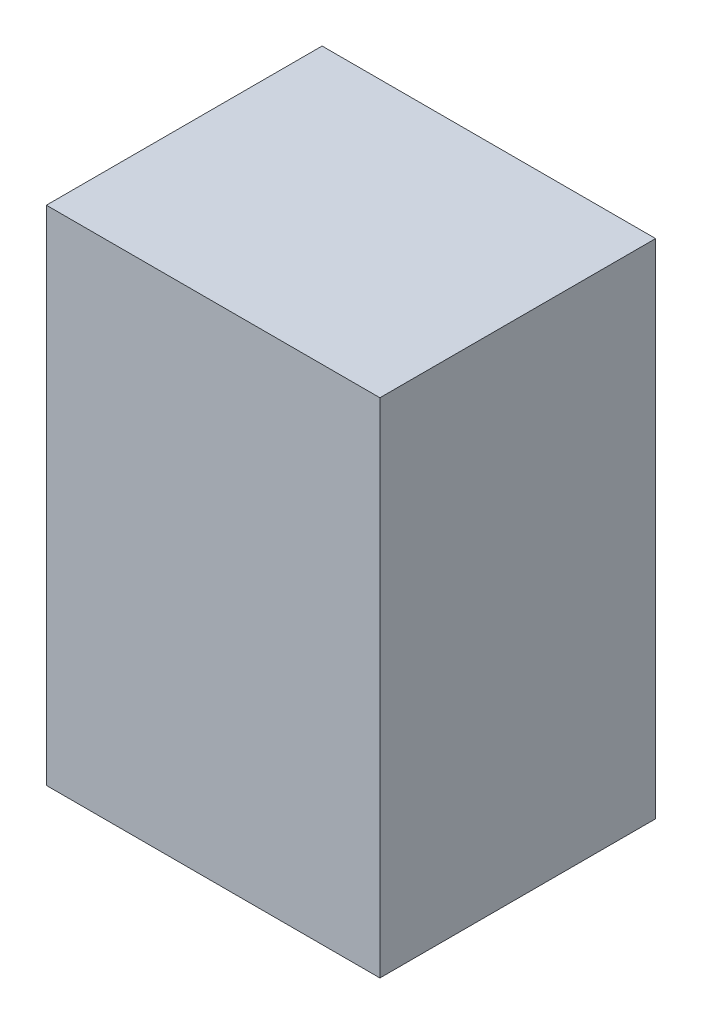
ISO-10303-21;
HEADER;
FILE_DESCRIPTION(('STEP AP214'),'2;1');
FILE_NAME('part.step','',(''),(''),'','','');
FILE_SCHEMA(('AUTOMOTIVE_DESIGN { 1 0 10303 214 1 1 1 1 }'));
ENDSEC;
DATA;
#1=APPLICATION_CONTEXT('core data for automotive mechanical design processes');
#2=APPLICATION_PROTOCOL_DEFINITION('international standard','automotive_design',2000,#1);
#3=PRODUCT_CONTEXT('',#1,'mechanical');
#4=PRODUCT('Part','Part','',(#3));
#5=PRODUCT_RELATED_PRODUCT_CATEGORY('part','',(#4));
#6=PRODUCT_DEFINITION_FORMATION('','',#4);
#7=PRODUCT_DEFINITION_CONTEXT('part definition',#1,'design');
#8=PRODUCT_DEFINITION('design','',#6,#7);
#9=PRODUCT_DEFINITION_SHAPE('','',#8);
#10=(LENGTH_UNIT() NAMED_UNIT(*) SI_UNIT(.MILLI.,.METRE.));
#11=(NAMED_UNIT(*) PLANE_ANGLE_UNIT() SI_UNIT($,.RADIAN.));
#12=(NAMED_UNIT(*) SI_UNIT($,.STERADIAN.) SOLID_ANGLE_UNIT());
#13=UNCERTAINTY_MEASURE_WITH_UNIT(LENGTH_MEASURE(1.E-05),#10,'distance_accuracy_value','');
#14=(GEOMETRIC_REPRESENTATION_CONTEXT(3) GLOBAL_UNCERTAINTY_ASSIGNED_CONTEXT((#13)) GLOBAL_UNIT_ASSIGNED_CONTEXT((#10,
#11,#12)) REPRESENTATION_CONTEXT('',''));
#15=CARTESIAN_POINT('',(0.,0.,0.));
#16=DIRECTION('',(0.,0.,1.));
#17=DIRECTION('',(1.,0.,0.));
#18=AXIS2_PLACEMENT_3D('',#15,#16,#17);
#19=CARTESIAN_POINT('',(-37.5,56.5,62.));
#20=DIRECTION('',(0.,-1.,0.));
#21=DIRECTION('',(1.,0.,0.));
#22=AXIS2_PLACEMENT_3D('',#19,#20,#21);
#23=PLANE('',#22);
#24=DIRECTION('',(-1.,0.,0.));
#25=VECTOR('',#24,1.);
#26=CARTESIAN_POINT('',(-37.5,56.5,0.));
#27=LINE('',#26,#25);
#28=CARTESIAN_POINT('',(37.5,56.5,0.));
#29=VERTEX_POINT('',#28);
#30=CARTESIAN_POINT('',(-37.5,56.5,0.));
#31=VERTEX_POINT('',#30);
#32=EDGE_CURVE('E102',#29,#31,#27,.T.);
#33=ORIENTED_EDGE('',*,*,#32,.T.);
#34=DIRECTION('',(0.,0.,-1.));
#35=VECTOR('',#34,1.);
#36=CARTESIAN_POINT('',(-37.5,56.5,62.));
#37=LINE('',#36,#35);
#38=CARTESIAN_POINT('',(-37.5,56.5,62.));
#39=VERTEX_POINT('',#38);
#40=EDGE_CURVE('E11',#39,#31,#37,.T.);
#41=ORIENTED_EDGE('',*,*,#40,.F.);
#42=DIRECTION('',(-1.,0.,0.));
#43=VECTOR('',#42,1.);
#44=CARTESIAN_POINT('',(-37.5,56.5,62.));
#45=LINE('',#44,#43);
#46=CARTESIAN_POINT('',(37.5,56.5,62.));
#47=VERTEX_POINT('',#46);
#48=EDGE_CURVE('E90',#47,#39,#45,.T.);
#49=ORIENTED_EDGE('',*,*,#48,.F.);
#50=DIRECTION('',(0.,0.,-1.));
#51=VECTOR('',#50,1.);
#52=CARTESIAN_POINT('',(37.5,56.5,62.));
#53=LINE('',#52,#51);
#54=EDGE_CURVE('E98',#47,#29,#53,.T.);
#55=ORIENTED_EDGE('',*,*,#54,.T.);
#56=EDGE_LOOP('',(#33,#41,#49,#55));
#57=FACE_BOUND('',#56,.T.);
#58=ADVANCED_FACE('F39',(#57),#23,.F.);
#59=CARTESIAN_POINT('',(-37.5,-56.5,62.));
#60=DIRECTION('',(1.,0.,0.));
#61=DIRECTION('',(0.,0.,-1.));
#62=AXIS2_PLACEMENT_3D('',#59,#60,#61);
#63=PLANE('',#62);
#64=DIRECTION('',(0.,-1.,0.));
#65=VECTOR('',#64,1.);
#66=CARTESIAN_POINT('',(-37.5,-56.5,0.));
#67=LINE('',#66,#65);
#68=CARTESIAN_POINT('',(-37.5,-56.5,0.));
#69=VERTEX_POINT('',#68);
#70=EDGE_CURVE('E94',#31,#69,#67,.T.);
#71=ORIENTED_EDGE('',*,*,#70,.T.);
#72=DIRECTION('',(0.,0.,-1.));
#73=VECTOR('',#72,1.);
#74=CARTESIAN_POINT('',(-37.5,-56.5,62.));
#75=LINE('',#74,#73);
#76=CARTESIAN_POINT('',(-37.5,-56.5,62.));
#77=VERTEX_POINT('',#76);
#78=EDGE_CURVE('E47',#77,#69,#75,.T.);
#79=ORIENTED_EDGE('',*,*,#78,.F.);
#80=DIRECTION('',(0.,-1.,0.));
#81=VECTOR('',#80,1.);
#82=CARTESIAN_POINT('',(-37.5,-56.5,62.));
#83=LINE('',#82,#81);
#84=EDGE_CURVE('E85',#39,#77,#83,.T.);
#85=ORIENTED_EDGE('',*,*,#84,.F.);
#86=ORIENTED_EDGE('',*,*,#40,.T.);
#87=EDGE_LOOP('',(#71,#79,#85,#86));
#88=FACE_BOUND('',#87,.T.);
#89=ADVANCED_FACE('F93',(#88),#63,.F.);
#90=CARTESIAN_POINT('',(-37.5,-56.5,62.));
#91=DIRECTION('',(0.,1.,0.));
#92=DIRECTION('',(-1.,0.,0.));
#93=AXIS2_PLACEMENT_3D('',#90,#91,#92);
#94=PLANE('',#93);
#95=DIRECTION('',(1.,0.,0.));
#96=VECTOR('',#95,1.);
#97=CARTESIAN_POINT('',(-37.5,-56.5,0.));
#98=LINE('',#97,#96);
#99=CARTESIAN_POINT('',(37.5,-56.5,0.));
#100=VERTEX_POINT('',#99);
#101=EDGE_CURVE('E72',#69,#100,#98,.T.);
#102=ORIENTED_EDGE('',*,*,#101,.T.);
#103=DIRECTION('',(0.,0.,-1.));
#104=VECTOR('',#103,1.);
#105=CARTESIAN_POINT('',(37.5,-56.5,62.));
#106=LINE('',#105,#104);
#107=CARTESIAN_POINT('',(37.5,-56.5,62.));
#108=VERTEX_POINT('',#107);
#109=EDGE_CURVE('E95',#108,#100,#106,.T.);
#110=ORIENTED_EDGE('',*,*,#109,.F.);
#111=DIRECTION('',(1.,0.,0.));
#112=VECTOR('',#111,1.);
#113=CARTESIAN_POINT('',(-37.5,-56.5,62.));
#114=LINE('',#113,#112);
#115=EDGE_CURVE('E88',#77,#108,#114,.T.);
#116=ORIENTED_EDGE('',*,*,#115,.F.);
#117=ORIENTED_EDGE('',*,*,#78,.T.);
#118=EDGE_LOOP('',(#102,#110,#116,#117));
#119=FACE_BOUND('',#118,.T.);
#120=ADVANCED_FACE('F96',(#119),#94,.F.);
#121=CARTESIAN_POINT('',(37.5,-56.5,62.));
#122=DIRECTION('',(-1.,0.,0.));
#123=DIRECTION('',(0.,0.,1.));
#124=AXIS2_PLACEMENT_3D('',#121,#122,#123);
#125=PLANE('',#124);
#126=DIRECTION('',(0.,1.,0.));
#127=VECTOR('',#126,1.);
#128=CARTESIAN_POINT('',(37.5,-56.5,0.));
#129=LINE('',#128,#127);
#130=EDGE_CURVE('E78',#100,#29,#129,.T.);
#131=ORIENTED_EDGE('',*,*,#130,.T.);
#132=ORIENTED_EDGE('',*,*,#54,.F.);
#133=DIRECTION('',(0.,1.,0.));
#134=VECTOR('',#133,1.);
#135=CARTESIAN_POINT('',(37.5,-56.5,62.));
#136=LINE('',#135,#134);
#137=EDGE_CURVE('E55',#108,#47,#136,.T.);
#138=ORIENTED_EDGE('',*,*,#137,.F.);
#139=ORIENTED_EDGE('',*,*,#109,.T.);
#140=EDGE_LOOP('',(#131,#132,#138,#139));
#141=FACE_BOUND('',#140,.T.);
#142=ADVANCED_FACE('F109',(#141),#125,.F.);
#143=CARTESIAN_POINT('',(0.,0.,62.));
#144=DIRECTION('',(0.,0.,1.));
#145=DIRECTION('',(1.,0.,0.));
#146=AXIS2_PLACEMENT_3D('',#143,#144,#145);
#147=PLANE('',#146);
#148=ORIENTED_EDGE('',*,*,#48,.T.);
#149=ORIENTED_EDGE('',*,*,#84,.T.);
#150=ORIENTED_EDGE('',*,*,#115,.T.);
#151=ORIENTED_EDGE('',*,*,#137,.T.);
#152=EDGE_LOOP('',(#148,#149,#150,#151));
#153=FACE_BOUND('',#152,.T.);
#154=ADVANCED_FACE('F86',(#153),#147,.T.);
#155=CARTESIAN_POINT('',(0.,0.,0.));
#156=DIRECTION('',(0.,0.,1.));
#157=DIRECTION('',(1.,0.,0.));
#158=AXIS2_PLACEMENT_3D('',#155,#156,#157);
#159=PLANE('',#158);
#160=ORIENTED_EDGE('',*,*,#32,.F.);
#161=ORIENTED_EDGE('',*,*,#130,.F.);
#162=ORIENTED_EDGE('',*,*,#101,.F.);
#163=ORIENTED_EDGE('',*,*,#70,.F.);
#164=EDGE_LOOP('',(#160,#161,#162,#163));
#165=FACE_BOUND('',#164,.T.);
#166=ADVANCED_FACE('F112',(#165),#159,.F.);
#167=CLOSED_SHELL('',(#58,#89,#120,#142,#154,#166));
#168=MANIFOLD_SOLID_BREP('B2',#167);
#169=ADVANCED_BREP_SHAPE_REPRESENTATION('',(#18,#168),#14);
#170=SHAPE_DEFINITION_REPRESENTATION(#9,#169);
ENDSEC;
END-ISO-10303-21;
